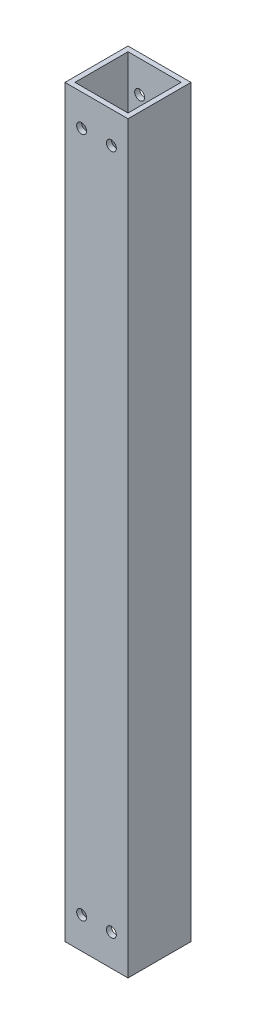
ISO-10303-21;
HEADER;
FILE_DESCRIPTION(('STEP AP214'),'2;1');
FILE_NAME('part.step','',(''),(''),'','','');
FILE_SCHEMA(('AUTOMOTIVE_DESIGN { 1 0 10303 214 1 1 1 1 }'));
ENDSEC;
DATA;
#1=APPLICATION_CONTEXT('core data for automotive mechanical design processes');
#2=APPLICATION_PROTOCOL_DEFINITION('international standard','automotive_design',2000,#1);
#3=PRODUCT_CONTEXT('',#1,'mechanical');
#4=PRODUCT('Part','Part','',(#3));
#5=PRODUCT_RELATED_PRODUCT_CATEGORY('part','',(#4));
#6=PRODUCT_DEFINITION_FORMATION('','',#4);
#7=PRODUCT_DEFINITION_CONTEXT('part definition',#1,'design');
#8=PRODUCT_DEFINITION('design','',#6,#7);
#9=PRODUCT_DEFINITION_SHAPE('','',#8);
#10=(LENGTH_UNIT() NAMED_UNIT(*) SI_UNIT(.MILLI.,.METRE.));
#11=(NAMED_UNIT(*) PLANE_ANGLE_UNIT() SI_UNIT($,.RADIAN.));
#12=(NAMED_UNIT(*) SI_UNIT($,.STERADIAN.) SOLID_ANGLE_UNIT());
#13=UNCERTAINTY_MEASURE_WITH_UNIT(LENGTH_MEASURE(1.E-05),#10,'distance_accuracy_value','');
#14=(GEOMETRIC_REPRESENTATION_CONTEXT(3) GLOBAL_UNCERTAINTY_ASSIGNED_CONTEXT((#13)) GLOBAL_UNIT_ASSIGNED_CONTEXT((#10,
#11,#12)) REPRESENTATION_CONTEXT('',''));
#15=CARTESIAN_POINT('',(0.,0.,0.));
#16=DIRECTION('',(0.,0.,1.));
#17=DIRECTION('',(1.,0.,0.));
#18=AXIS2_PLACEMENT_3D('',#15,#16,#17);
#19=CARTESIAN_POINT('',(0.,300.,0.));
#20=DIRECTION('',(0.,1.,0.));
#21=DIRECTION('',(0.,0.,1.));
#22=AXIS2_PLACEMENT_3D('',#19,#20,#21);
#23=PLANE('',#22);
#24=DIRECTION('',(0.,0.,1.));
#25=VECTOR('',#24,1.);
#26=CARTESIAN_POINT('',(-12.7,300.,12.7));
#27=LINE('',#26,#25);
#28=CARTESIAN_POINT('',(-12.7,300.,-12.7));
#29=VERTEX_POINT('',#28);
#30=CARTESIAN_POINT('',(-12.7,300.,12.7));
#31=VERTEX_POINT('',#30);
#32=EDGE_CURVE('E137',#29,#31,#27,.T.);
#33=ORIENTED_EDGE('',*,*,#32,.T.);
#34=DIRECTION('',(1.,0.,0.));
#35=VECTOR('',#34,1.);
#36=CARTESIAN_POINT('',(12.7,300.,12.7));
#37=LINE('',#36,#35);
#38=CARTESIAN_POINT('',(12.7,300.,12.7));
#39=VERTEX_POINT('',#38);
#40=EDGE_CURVE('E140',#31,#39,#37,.T.);
#41=ORIENTED_EDGE('',*,*,#40,.T.);
#42=DIRECTION('',(0.,0.,-1.));
#43=VECTOR('',#42,1.);
#44=CARTESIAN_POINT('',(12.7,300.,12.7));
#45=LINE('',#44,#43);
#46=CARTESIAN_POINT('',(12.7,300.,-12.7));
#47=VERTEX_POINT('',#46);
#48=EDGE_CURVE('E143',#39,#47,#45,.T.);
#49=ORIENTED_EDGE('',*,*,#48,.T.);
#50=DIRECTION('',(-1.,0.,0.));
#51=VECTOR('',#50,1.);
#52=CARTESIAN_POINT('',(12.7,300.,-12.7));
#53=LINE('',#52,#51);
#54=EDGE_CURVE('E145',#47,#29,#53,.T.);
#55=ORIENTED_EDGE('',*,*,#54,.T.);
#56=EDGE_LOOP('',(#33,#41,#49,#55));
#57=FACE_BOUND('',#56,.T.);
#58=DIRECTION('',(0.,0.,-1.));
#59=VECTOR('',#58,1.);
#60=CARTESIAN_POINT('',(10.7,300.,10.7));
#61=LINE('',#60,#59);
#62=CARTESIAN_POINT('',(10.7,300.,10.7));
#63=VERTEX_POINT('',#62);
#64=CARTESIAN_POINT('',(10.7,300.,-10.7));
#65=VERTEX_POINT('',#64);
#66=EDGE_CURVE('E107',#63,#65,#61,.T.);
#67=ORIENTED_EDGE('',*,*,#66,.F.);
#68=DIRECTION('',(1.,0.,0.));
#69=VECTOR('',#68,1.);
#70=CARTESIAN_POINT('',(10.7,300.,10.7));
#71=LINE('',#70,#69);
#72=CARTESIAN_POINT('',(-10.7,300.,10.7));
#73=VERTEX_POINT('',#72);
#74=EDGE_CURVE('E99',#73,#63,#71,.T.);
#75=ORIENTED_EDGE('',*,*,#74,.F.);
#76=DIRECTION('',(0.,0.,1.));
#77=VECTOR('',#76,1.);
#78=CARTESIAN_POINT('',(-10.7,300.,10.7));
#79=LINE('',#78,#77);
#80=CARTESIAN_POINT('',(-10.7,300.,-10.7));
#81=VERTEX_POINT('',#80);
#82=EDGE_CURVE('E121',#81,#73,#79,.T.);
#83=ORIENTED_EDGE('',*,*,#82,.F.);
#84=DIRECTION('',(-1.,0.,0.));
#85=VECTOR('',#84,1.);
#86=CARTESIAN_POINT('',(10.7,300.,-10.7));
#87=LINE('',#86,#85);
#88=EDGE_CURVE('E119',#65,#81,#87,.T.);
#89=ORIENTED_EDGE('',*,*,#88,.F.);
#90=EDGE_LOOP('',(#67,#75,#83,#89));
#91=FACE_BOUND('',#90,.T.);
#92=ADVANCED_FACE('F32',(#57,#91),#23,.T.);
#93=CARTESIAN_POINT('',(0.,0.,0.));
#94=DIRECTION('',(0.,1.,0.));
#95=DIRECTION('',(0.,0.,1.));
#96=AXIS2_PLACEMENT_3D('',#93,#94,#95);
#97=PLANE('',#96);
#98=DIRECTION('',(0.,0.,1.));
#99=VECTOR('',#98,1.);
#100=CARTESIAN_POINT('',(-12.7,0.,12.7));
#101=LINE('',#100,#99);
#102=CARTESIAN_POINT('',(-12.7,0.,-12.7));
#103=VERTEX_POINT('',#102);
#104=CARTESIAN_POINT('',(-12.7,0.,12.7));
#105=VERTEX_POINT('',#104);
#106=EDGE_CURVE('E115',#103,#105,#101,.T.);
#107=ORIENTED_EDGE('',*,*,#106,.F.);
#108=DIRECTION('',(-1.,0.,0.));
#109=VECTOR('',#108,1.);
#110=CARTESIAN_POINT('',(12.7,0.,-12.7));
#111=LINE('',#110,#109);
#112=CARTESIAN_POINT('',(12.7,0.,-12.7));
#113=VERTEX_POINT('',#112);
#114=EDGE_CURVE('E141',#113,#103,#111,.T.);
#115=ORIENTED_EDGE('',*,*,#114,.F.);
#116=DIRECTION('',(0.,0.,-1.));
#117=VECTOR('',#116,1.);
#118=CARTESIAN_POINT('',(12.7,0.,12.7));
#119=LINE('',#118,#117);
#120=CARTESIAN_POINT('',(12.7,0.,12.7));
#121=VERTEX_POINT('',#120);
#122=EDGE_CURVE('E152',#121,#113,#119,.T.);
#123=ORIENTED_EDGE('',*,*,#122,.F.);
#124=DIRECTION('',(1.,0.,0.));
#125=VECTOR('',#124,1.);
#126=CARTESIAN_POINT('',(12.7,0.,12.7));
#127=LINE('',#126,#125);
#128=EDGE_CURVE('E150',#105,#121,#127,.T.);
#129=ORIENTED_EDGE('',*,*,#128,.F.);
#130=EDGE_LOOP('',(#107,#115,#123,#129));
#131=FACE_BOUND('',#130,.T.);
#132=DIRECTION('',(1.,0.,0.));
#133=VECTOR('',#132,1.);
#134=CARTESIAN_POINT('',(10.7,0.,10.7));
#135=LINE('',#134,#133);
#136=CARTESIAN_POINT('',(-10.7,0.,10.7));
#137=VERTEX_POINT('',#136);
#138=CARTESIAN_POINT('',(10.7,0.,10.7));
#139=VERTEX_POINT('',#138);
#140=EDGE_CURVE('E57',#137,#139,#135,.T.);
#141=ORIENTED_EDGE('',*,*,#140,.T.);
#142=DIRECTION('',(0.,0.,-1.));
#143=VECTOR('',#142,1.);
#144=CARTESIAN_POINT('',(10.7,0.,10.7));
#145=LINE('',#144,#143);
#146=CARTESIAN_POINT('',(10.7,0.,-10.7));
#147=VERTEX_POINT('',#146);
#148=EDGE_CURVE('E114',#139,#147,#145,.T.);
#149=ORIENTED_EDGE('',*,*,#148,.T.);
#150=DIRECTION('',(-1.,0.,0.));
#151=VECTOR('',#150,1.);
#152=CARTESIAN_POINT('',(10.7,0.,-10.7));
#153=LINE('',#152,#151);
#154=CARTESIAN_POINT('',(-10.7,0.,-10.7));
#155=VERTEX_POINT('',#154);
#156=EDGE_CURVE('E129',#147,#155,#153,.T.);
#157=ORIENTED_EDGE('',*,*,#156,.T.);
#158=DIRECTION('',(0.,0.,1.));
#159=VECTOR('',#158,1.);
#160=CARTESIAN_POINT('',(-10.7,0.,10.7));
#161=LINE('',#160,#159);
#162=EDGE_CURVE('E108',#155,#137,#161,.T.);
#163=ORIENTED_EDGE('',*,*,#162,.T.);
#164=EDGE_LOOP('',(#141,#149,#157,#163));
#165=FACE_BOUND('',#164,.T.);
#166=ADVANCED_FACE('F216',(#131,#165),#97,.F.);
#167=CARTESIAN_POINT('',(-12.7,300.,12.7));
#168=DIRECTION('',(1.,0.,0.));
#169=DIRECTION('',(0.,0.,-1.));
#170=AXIS2_PLACEMENT_3D('',#167,#168,#169);
#171=PLANE('',#170);
#172=ORIENTED_EDGE('',*,*,#106,.T.);
#173=DIRECTION('',(0.,-1.,0.));
#174=VECTOR('',#173,1.);
#175=CARTESIAN_POINT('',(-12.7,300.,12.7));
#176=LINE('',#175,#174);
#177=EDGE_CURVE('E11',#31,#105,#176,.T.);
#178=ORIENTED_EDGE('',*,*,#177,.F.);
#179=ORIENTED_EDGE('',*,*,#32,.F.);
#180=DIRECTION('',(0.,-1.,0.));
#181=VECTOR('',#180,1.);
#182=CARTESIAN_POINT('',(-12.7,300.,-12.7));
#183=LINE('',#182,#181);
#184=EDGE_CURVE('E147',#29,#103,#183,.T.);
#185=ORIENTED_EDGE('',*,*,#184,.T.);
#186=EDGE_LOOP('',(#172,#178,#179,#185));
#187=FACE_BOUND('',#186,.T.);
#188=ADVANCED_FACE('F34',(#187),#171,.F.);
#189=CARTESIAN_POINT('',(12.7,300.,12.7));
#190=DIRECTION('',(0.,0.,-1.));
#191=DIRECTION('',(-1.,0.,0.));
#192=AXIS2_PLACEMENT_3D('',#189,#190,#191);
#193=PLANE('',#192);
#194=CARTESIAN_POINT('',(6.,12.7,12.7));
#195=DIRECTION('',(0.,0.,-1.));
#196=DIRECTION('',(-1.,0.,0.));
#197=AXIS2_PLACEMENT_3D('',#194,#195,#196);
#198=CIRCLE('',#197,2.);
#199=CARTESIAN_POINT('',(4.,12.7,12.7));
#200=VERTEX_POINT('',#199);
#201=EDGE_CURVE('E127',#200,#200,#198,.T.);
#202=ORIENTED_EDGE('',*,*,#201,.T.);
#203=EDGE_LOOP('',(#202));
#204=FACE_BOUND('',#203,.T.);
#205=CARTESIAN_POINT('',(-6.,12.7,12.7));
#206=DIRECTION('',(0.,0.,-1.));
#207=DIRECTION('',(-1.,0.,0.));
#208=AXIS2_PLACEMENT_3D('',#205,#206,#207);
#209=CIRCLE('',#208,2.);
#210=CARTESIAN_POINT('',(-8.,12.7,12.7));
#211=VERTEX_POINT('',#210);
#212=EDGE_CURVE('E178',#211,#211,#209,.T.);
#213=ORIENTED_EDGE('',*,*,#212,.T.);
#214=EDGE_LOOP('',(#213));
#215=FACE_BOUND('',#214,.T.);
#216=CARTESIAN_POINT('',(-6.,287.3,12.7));
#217=DIRECTION('',(0.,0.,-1.));
#218=DIRECTION('',(-1.,0.,0.));
#219=AXIS2_PLACEMENT_3D('',#216,#217,#218);
#220=CIRCLE('',#219,2.);
#221=CARTESIAN_POINT('',(-8.,287.3,12.7));
#222=VERTEX_POINT('',#221);
#223=EDGE_CURVE('E174',#222,#222,#220,.T.);
#224=ORIENTED_EDGE('',*,*,#223,.T.);
#225=EDGE_LOOP('',(#224));
#226=FACE_BOUND('',#225,.T.);
#227=CARTESIAN_POINT('',(6.,287.3,12.7));
#228=DIRECTION('',(0.,0.,-1.));
#229=DIRECTION('',(-1.,0.,0.));
#230=AXIS2_PLACEMENT_3D('',#227,#228,#229);
#231=CIRCLE('',#230,2.);
#232=CARTESIAN_POINT('',(4.,287.3,12.7));
#233=VERTEX_POINT('',#232);
#234=EDGE_CURVE('E170',#233,#233,#231,.T.);
#235=ORIENTED_EDGE('',*,*,#234,.T.);
#236=EDGE_LOOP('',(#235));
#237=FACE_BOUND('',#236,.T.);
#238=ORIENTED_EDGE('',*,*,#128,.T.);
#239=DIRECTION('',(0.,-1.,0.));
#240=VECTOR('',#239,1.);
#241=CARTESIAN_POINT('',(12.7,300.,12.7));
#242=LINE('',#241,#240);
#243=EDGE_CURVE('E41',#39,#121,#242,.T.);
#244=ORIENTED_EDGE('',*,*,#243,.F.);
#245=ORIENTED_EDGE('',*,*,#40,.F.);
#246=ORIENTED_EDGE('',*,*,#177,.T.);
#247=EDGE_LOOP('',(#238,#244,#245,#246));
#248=FACE_BOUND('',#247,.T.);
#249=ADVANCED_FACE('F195',(#204,#215,#226,#237,#248),#193,.F.);
#250=CARTESIAN_POINT('',(12.7,300.,12.7));
#251=DIRECTION('',(-1.,0.,0.));
#252=DIRECTION('',(0.,0.,1.));
#253=AXIS2_PLACEMENT_3D('',#250,#251,#252);
#254=PLANE('',#253);
#255=ORIENTED_EDGE('',*,*,#122,.T.);
#256=DIRECTION('',(0.,-1.,0.));
#257=VECTOR('',#256,1.);
#258=CARTESIAN_POINT('',(12.7,300.,-12.7));
#259=LINE('',#258,#257);
#260=EDGE_CURVE('E157',#47,#113,#259,.T.);
#261=ORIENTED_EDGE('',*,*,#260,.F.);
#262=ORIENTED_EDGE('',*,*,#48,.F.);
#263=ORIENTED_EDGE('',*,*,#243,.T.);
#264=EDGE_LOOP('',(#255,#261,#262,#263));
#265=FACE_BOUND('',#264,.T.);
#266=ADVANCED_FACE('F230',(#265),#254,.F.);
#267=CARTESIAN_POINT('',(12.7,300.,-12.7));
#268=DIRECTION('',(0.,0.,1.));
#269=DIRECTION('',(1.,0.,0.));
#270=AXIS2_PLACEMENT_3D('',#267,#268,#269);
#271=PLANE('',#270);
#272=CARTESIAN_POINT('',(6.,12.7,-12.7));
#273=DIRECTION('',(0.,0.,1.));
#274=DIRECTION('',(1.,0.,0.));
#275=AXIS2_PLACEMENT_3D('',#272,#273,#274);
#276=CIRCLE('',#275,2.);
#277=CARTESIAN_POINT('',(8.,12.7,-12.7));
#278=VERTEX_POINT('',#277);
#279=EDGE_CURVE('E290',#278,#278,#276,.T.);
#280=ORIENTED_EDGE('',*,*,#279,.T.);
#281=EDGE_LOOP('',(#280));
#282=FACE_BOUND('',#281,.T.);
#283=CARTESIAN_POINT('',(-6.,12.7,-12.7));
#284=DIRECTION('',(0.,0.,1.));
#285=DIRECTION('',(1.,0.,0.));
#286=AXIS2_PLACEMENT_3D('',#283,#284,#285);
#287=CIRCLE('',#286,2.);
#288=CARTESIAN_POINT('',(-4.,12.7,-12.7));
#289=VERTEX_POINT('',#288);
#290=EDGE_CURVE('E293',#289,#289,#287,.T.);
#291=ORIENTED_EDGE('',*,*,#290,.T.);
#292=EDGE_LOOP('',(#291));
#293=FACE_BOUND('',#292,.T.);
#294=CARTESIAN_POINT('',(-6.,287.3,-12.7));
#295=DIRECTION('',(0.,0.,1.));
#296=DIRECTION('',(-1.,0.,0.));
#297=AXIS2_PLACEMENT_3D('',#294,#295,#296);
#298=CIRCLE('',#297,2.);
#299=CARTESIAN_POINT('',(-8.,287.3,-12.7));
#300=VERTEX_POINT('',#299);
#301=EDGE_CURVE('E289',#300,#300,#298,.T.);
#302=ORIENTED_EDGE('',*,*,#301,.T.);
#303=EDGE_LOOP('',(#302));
#304=FACE_BOUND('',#303,.T.);
#305=CARTESIAN_POINT('',(6.,287.3,-12.7));
#306=DIRECTION('',(0.,0.,1.));
#307=DIRECTION('',(-1.,0.,0.));
#308=AXIS2_PLACEMENT_3D('',#305,#306,#307);
#309=CIRCLE('',#308,2.);
#310=CARTESIAN_POINT('',(4.,287.3,-12.7));
#311=VERTEX_POINT('',#310);
#312=EDGE_CURVE('E166',#311,#311,#309,.T.);
#313=ORIENTED_EDGE('',*,*,#312,.T.);
#314=EDGE_LOOP('',(#313));
#315=FACE_BOUND('',#314,.T.);
#316=ORIENTED_EDGE('',*,*,#114,.T.);
#317=ORIENTED_EDGE('',*,*,#184,.F.);
#318=ORIENTED_EDGE('',*,*,#54,.F.);
#319=ORIENTED_EDGE('',*,*,#260,.T.);
#320=EDGE_LOOP('',(#316,#317,#318,#319));
#321=FACE_BOUND('',#320,.T.);
#322=ADVANCED_FACE('F227',(#282,#293,#304,#315,#321),#271,.F.);
#323=CARTESIAN_POINT('',(10.7,300.,10.7));
#324=DIRECTION('',(0.,0.,-1.));
#325=DIRECTION('',(-1.,0.,0.));
#326=AXIS2_PLACEMENT_3D('',#323,#324,#325);
#327=PLANE('',#326);
#328=CARTESIAN_POINT('',(6.,12.7,10.7));
#329=DIRECTION('',(0.,0.,-1.));
#330=DIRECTION('',(-1.,0.,0.));
#331=AXIS2_PLACEMENT_3D('',#328,#329,#330);
#332=CIRCLE('',#331,2.);
#333=CARTESIAN_POINT('',(4.,12.7,10.7));
#334=VERTEX_POINT('',#333);
#335=EDGE_CURVE('E190',#334,#334,#332,.T.);
#336=ORIENTED_EDGE('',*,*,#335,.F.);
#337=EDGE_LOOP('',(#336));
#338=FACE_BOUND('',#337,.T.);
#339=CARTESIAN_POINT('',(-6.,12.7,10.7));
#340=DIRECTION('',(0.,0.,-1.));
#341=DIRECTION('',(-1.,0.,0.));
#342=AXIS2_PLACEMENT_3D('',#339,#340,#341);
#343=CIRCLE('',#342,2.);
#344=CARTESIAN_POINT('',(-8.,12.7,10.7));
#345=VERTEX_POINT('',#344);
#346=EDGE_CURVE('E173',#345,#345,#343,.T.);
#347=ORIENTED_EDGE('',*,*,#346,.F.);
#348=EDGE_LOOP('',(#347));
#349=FACE_BOUND('',#348,.T.);
#350=CARTESIAN_POINT('',(-6.,287.3,10.7));
#351=DIRECTION('',(0.,0.,-1.));
#352=DIRECTION('',(-1.,0.,0.));
#353=AXIS2_PLACEMENT_3D('',#350,#351,#352);
#354=CIRCLE('',#353,2.);
#355=CARTESIAN_POINT('',(-8.,287.3,10.7));
#356=VERTEX_POINT('',#355);
#357=EDGE_CURVE('E169',#356,#356,#354,.T.);
#358=ORIENTED_EDGE('',*,*,#357,.F.);
#359=EDGE_LOOP('',(#358));
#360=FACE_BOUND('',#359,.T.);
#361=CARTESIAN_POINT('',(6.,287.3,10.7));
#362=DIRECTION('',(0.,0.,-1.));
#363=DIRECTION('',(-1.,0.,0.));
#364=AXIS2_PLACEMENT_3D('',#361,#362,#363);
#365=CIRCLE('',#364,2.);
#366=CARTESIAN_POINT('',(4.,287.3,10.7));
#367=VERTEX_POINT('',#366);
#368=EDGE_CURVE('E165',#367,#367,#365,.T.);
#369=ORIENTED_EDGE('',*,*,#368,.F.);
#370=EDGE_LOOP('',(#369));
#371=FACE_BOUND('',#370,.T.);
#372=ORIENTED_EDGE('',*,*,#140,.F.);
#373=DIRECTION('',(0.,-1.,0.));
#374=VECTOR('',#373,1.);
#375=CARTESIAN_POINT('',(-10.7,300.,10.7));
#376=LINE('',#375,#374);
#377=EDGE_CURVE('E103',#73,#137,#376,.T.);
#378=ORIENTED_EDGE('',*,*,#377,.F.);
#379=ORIENTED_EDGE('',*,*,#74,.T.);
#380=DIRECTION('',(0.,-1.,0.));
#381=VECTOR('',#380,1.);
#382=CARTESIAN_POINT('',(10.7,300.,10.7));
#383=LINE('',#382,#381);
#384=EDGE_CURVE('E102',#63,#139,#383,.T.);
#385=ORIENTED_EDGE('',*,*,#384,.T.);
#386=EDGE_LOOP('',(#372,#378,#379,#385));
#387=FACE_BOUND('',#386,.T.);
#388=ADVANCED_FACE('F101',(#338,#349,#360,#371,#387),#327,.T.);
#389=CARTESIAN_POINT('',(10.7,300.,10.7));
#390=DIRECTION('',(-1.,0.,0.));
#391=DIRECTION('',(0.,0.,1.));
#392=AXIS2_PLACEMENT_3D('',#389,#390,#391);
#393=PLANE('',#392);
#394=ORIENTED_EDGE('',*,*,#148,.F.);
#395=ORIENTED_EDGE('',*,*,#384,.F.);
#396=ORIENTED_EDGE('',*,*,#66,.T.);
#397=DIRECTION('',(0.,-1.,0.));
#398=VECTOR('',#397,1.);
#399=CARTESIAN_POINT('',(10.7,300.,-10.7));
#400=LINE('',#399,#398);
#401=EDGE_CURVE('E116',#65,#147,#400,.T.);
#402=ORIENTED_EDGE('',*,*,#401,.T.);
#403=EDGE_LOOP('',(#394,#395,#396,#402));
#404=FACE_BOUND('',#403,.T.);
#405=ADVANCED_FACE('F111',(#404),#393,.T.);
#406=CARTESIAN_POINT('',(10.7,300.,-10.7));
#407=DIRECTION('',(0.,0.,1.));
#408=DIRECTION('',(1.,0.,0.));
#409=AXIS2_PLACEMENT_3D('',#406,#407,#408);
#410=PLANE('',#409);
#411=CARTESIAN_POINT('',(6.,12.7,-10.7));
#412=DIRECTION('',(0.,0.,1.));
#413=DIRECTION('',(1.,0.,0.));
#414=AXIS2_PLACEMENT_3D('',#411,#412,#413);
#415=CIRCLE('',#414,2.);
#416=CARTESIAN_POINT('',(8.,12.7,-10.7));
#417=VERTEX_POINT('',#416);
#418=EDGE_CURVE('E36',#417,#417,#415,.T.);
#419=ORIENTED_EDGE('',*,*,#418,.F.);
#420=EDGE_LOOP('',(#419));
#421=FACE_BOUND('',#420,.T.);
#422=CARTESIAN_POINT('',(-6.,12.7,-10.7));
#423=DIRECTION('',(0.,0.,1.));
#424=DIRECTION('',(1.,0.,0.));
#425=AXIS2_PLACEMENT_3D('',#422,#423,#424);
#426=CIRCLE('',#425,2.);
#427=CARTESIAN_POINT('',(-4.,12.7,-10.7));
#428=VERTEX_POINT('',#427);
#429=EDGE_CURVE('E171',#428,#428,#426,.T.);
#430=ORIENTED_EDGE('',*,*,#429,.F.);
#431=EDGE_LOOP('',(#430));
#432=FACE_BOUND('',#431,.T.);
#433=CARTESIAN_POINT('',(-6.,287.3,-10.7));
#434=DIRECTION('',(0.,0.,1.));
#435=DIRECTION('',(1.,0.,0.));
#436=AXIS2_PLACEMENT_3D('',#433,#434,#435);
#437=CIRCLE('',#436,2.);
#438=CARTESIAN_POINT('',(-4.,287.3,-10.7));
#439=VERTEX_POINT('',#438);
#440=EDGE_CURVE('E167',#439,#439,#437,.T.);
#441=ORIENTED_EDGE('',*,*,#440,.F.);
#442=EDGE_LOOP('',(#441));
#443=FACE_BOUND('',#442,.T.);
#444=CARTESIAN_POINT('',(6.,287.3,-10.7));
#445=DIRECTION('',(0.,0.,1.));
#446=DIRECTION('',(1.,0.,0.));
#447=AXIS2_PLACEMENT_3D('',#444,#445,#446);
#448=CIRCLE('',#447,2.);
#449=CARTESIAN_POINT('',(8.,287.3,-10.7));
#450=VERTEX_POINT('',#449);
#451=EDGE_CURVE('E162',#450,#450,#448,.T.);
#452=ORIENTED_EDGE('',*,*,#451,.F.);
#453=EDGE_LOOP('',(#452));
#454=FACE_BOUND('',#453,.T.);
#455=ORIENTED_EDGE('',*,*,#156,.F.);
#456=ORIENTED_EDGE('',*,*,#401,.F.);
#457=ORIENTED_EDGE('',*,*,#88,.T.);
#458=DIRECTION('',(0.,-1.,0.));
#459=VECTOR('',#458,1.);
#460=CARTESIAN_POINT('',(-10.7,300.,-10.7));
#461=LINE('',#460,#459);
#462=EDGE_CURVE('E49',#81,#155,#461,.T.);
#463=ORIENTED_EDGE('',*,*,#462,.T.);
#464=EDGE_LOOP('',(#455,#456,#457,#463));
#465=FACE_BOUND('',#464,.T.);
#466=ADVANCED_FACE('F258',(#421,#432,#443,#454,#465),#410,.T.);
#467=CARTESIAN_POINT('',(-10.7,300.,10.7));
#468=DIRECTION('',(1.,0.,0.));
#469=DIRECTION('',(0.,0.,-1.));
#470=AXIS2_PLACEMENT_3D('',#467,#468,#469);
#471=PLANE('',#470);
#472=ORIENTED_EDGE('',*,*,#162,.F.);
#473=ORIENTED_EDGE('',*,*,#462,.F.);
#474=ORIENTED_EDGE('',*,*,#82,.T.);
#475=ORIENTED_EDGE('',*,*,#377,.T.);
#476=EDGE_LOOP('',(#472,#473,#474,#475));
#477=FACE_BOUND('',#476,.T.);
#478=ADVANCED_FACE('F255',(#477),#471,.T.);
#479=CARTESIAN_POINT('',(6.,287.3,-12.7));
#480=DIRECTION('',(0.,0.,1.));
#481=DIRECTION('',(1.,0.,0.));
#482=AXIS2_PLACEMENT_3D('',#479,#480,#481);
#483=CYLINDRICAL_SURFACE('',#482,2.);
#484=ORIENTED_EDGE('',*,*,#451,.T.);
#485=EDGE_LOOP('',(#484));
#486=FACE_BOUND('',#485,.T.);
#487=ORIENTED_EDGE('',*,*,#312,.F.);
#488=EDGE_LOOP('',(#487));
#489=FACE_BOUND('',#488,.T.);
#490=ADVANCED_FACE('F257',(#486,#489),#483,.F.);
#491=CARTESIAN_POINT('',(-6.,287.3,-12.7));
#492=DIRECTION('',(0.,0.,1.));
#493=DIRECTION('',(1.,0.,0.));
#494=AXIS2_PLACEMENT_3D('',#491,#492,#493);
#495=CYLINDRICAL_SURFACE('',#494,2.);
#496=ORIENTED_EDGE('',*,*,#440,.T.);
#497=EDGE_LOOP('',(#496));
#498=FACE_BOUND('',#497,.T.);
#499=ORIENTED_EDGE('',*,*,#301,.F.);
#500=EDGE_LOOP('',(#499));
#501=FACE_BOUND('',#500,.T.);
#502=ADVANCED_FACE('F264',(#498,#501),#495,.F.);
#503=CARTESIAN_POINT('',(-6.,12.7,-12.7));
#504=DIRECTION('',(0.,0.,1.));
#505=DIRECTION('',(1.,0.,0.));
#506=AXIS2_PLACEMENT_3D('',#503,#504,#505);
#507=CYLINDRICAL_SURFACE('',#506,2.);
#508=ORIENTED_EDGE('',*,*,#429,.T.);
#509=EDGE_LOOP('',(#508));
#510=FACE_BOUND('',#509,.T.);
#511=ORIENTED_EDGE('',*,*,#290,.F.);
#512=EDGE_LOOP('',(#511));
#513=FACE_BOUND('',#512,.T.);
#514=ADVANCED_FACE('F210',(#510,#513),#507,.F.);
#515=CARTESIAN_POINT('',(6.,12.7,-12.7));
#516=DIRECTION('',(0.,0.,1.));
#517=DIRECTION('',(1.,0.,0.));
#518=AXIS2_PLACEMENT_3D('',#515,#516,#517);
#519=CYLINDRICAL_SURFACE('',#518,2.);
#520=ORIENTED_EDGE('',*,*,#418,.T.);
#521=EDGE_LOOP('',(#520));
#522=FACE_BOUND('',#521,.T.);
#523=ORIENTED_EDGE('',*,*,#279,.F.);
#524=EDGE_LOOP('',(#523));
#525=FACE_BOUND('',#524,.T.);
#526=ADVANCED_FACE('F203',(#522,#525),#519,.F.);
#527=ORIENTED_EDGE('',*,*,#368,.T.);
#528=EDGE_LOOP('',(#527));
#529=FACE_BOUND('',#528,.T.);
#530=ORIENTED_EDGE('',*,*,#234,.F.);
#531=EDGE_LOOP('',(#530));
#532=FACE_BOUND('',#531,.T.);
#533=ADVANCED_FACE('F213',(#529,#532),#483,.F.);
#534=ORIENTED_EDGE('',*,*,#357,.T.);
#535=EDGE_LOOP('',(#534));
#536=FACE_BOUND('',#535,.T.);
#537=ORIENTED_EDGE('',*,*,#223,.F.);
#538=EDGE_LOOP('',(#537));
#539=FACE_BOUND('',#538,.T.);
#540=ADVANCED_FACE('F207',(#536,#539),#495,.F.);
#541=ORIENTED_EDGE('',*,*,#346,.T.);
#542=EDGE_LOOP('',(#541));
#543=FACE_BOUND('',#542,.T.);
#544=ORIENTED_EDGE('',*,*,#212,.F.);
#545=EDGE_LOOP('',(#544));
#546=FACE_BOUND('',#545,.T.);
#547=ADVANCED_FACE('F200',(#543,#546),#507,.F.);
#548=ORIENTED_EDGE('',*,*,#335,.T.);
#549=EDGE_LOOP('',(#548));
#550=FACE_BOUND('',#549,.T.);
#551=ORIENTED_EDGE('',*,*,#201,.F.);
#552=EDGE_LOOP('',(#551));
#553=FACE_BOUND('',#552,.T.);
#554=ADVANCED_FACE('F198',(#550,#553),#519,.F.);
#555=CLOSED_SHELL('',(#92,#166,#188,#249,#266,#322,#388,#405,#466,#478,#490,#502,#514,#526,#533,
#540,#547,#554));
#556=MANIFOLD_SOLID_BREP('B2',#555);
#557=ADVANCED_BREP_SHAPE_REPRESENTATION('',(#18,#556),#14);
#558=SHAPE_DEFINITION_REPRESENTATION(#9,#557);
ENDSEC;
END-ISO-10303-21;
